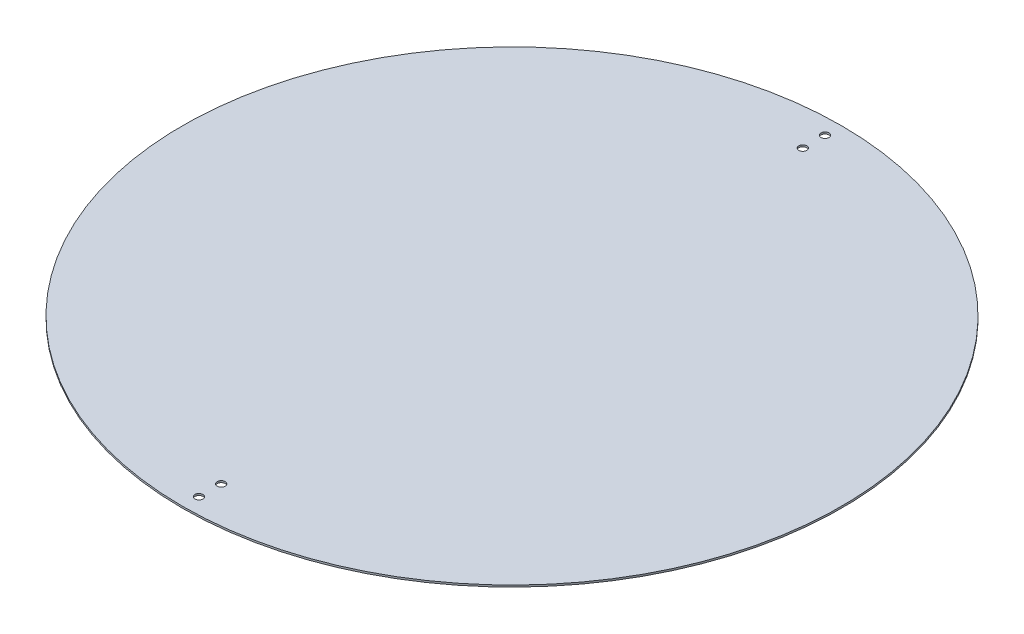
ISO-10303-21;
HEADER;
FILE_DESCRIPTION(('STEP AP214'),'2;1');
FILE_NAME('part.step','',(''),(''),'','','');
FILE_SCHEMA(('AUTOMOTIVE_DESIGN { 1 0 10303 214 1 1 1 1 }'));
ENDSEC;
DATA;
#1=APPLICATION_CONTEXT('core data for automotive mechanical design processes');
#2=APPLICATION_PROTOCOL_DEFINITION('international standard','automotive_design',2000,#1);
#3=PRODUCT_CONTEXT('',#1,'mechanical');
#4=PRODUCT('Part','Part','',(#3));
#5=PRODUCT_RELATED_PRODUCT_CATEGORY('part','',(#4));
#6=PRODUCT_DEFINITION_FORMATION('','',#4);
#7=PRODUCT_DEFINITION_CONTEXT('part definition',#1,'design');
#8=PRODUCT_DEFINITION('design','',#6,#7);
#9=PRODUCT_DEFINITION_SHAPE('','',#8);
#10=(LENGTH_UNIT() NAMED_UNIT(*) SI_UNIT(.MILLI.,.METRE.));
#11=(NAMED_UNIT(*) PLANE_ANGLE_UNIT() SI_UNIT($,.RADIAN.));
#12=(NAMED_UNIT(*) SI_UNIT($,.STERADIAN.) SOLID_ANGLE_UNIT());
#13=UNCERTAINTY_MEASURE_WITH_UNIT(LENGTH_MEASURE(1.E-05),#10,'distance_accuracy_value','');
#14=(GEOMETRIC_REPRESENTATION_CONTEXT(3) GLOBAL_UNCERTAINTY_ASSIGNED_CONTEXT((#13)) GLOBAL_UNIT_ASSIGNED_CONTEXT((#10,
#11,#12)) REPRESENTATION_CONTEXT('',''));
#15=CARTESIAN_POINT('',(0.,0.,0.));
#16=DIRECTION('',(0.,0.,1.));
#17=DIRECTION('',(1.,0.,0.));
#18=AXIS2_PLACEMENT_3D('',#15,#16,#17);
#19=CARTESIAN_POINT('',(0.,1.,0.));
#20=DIRECTION('',(0.,-1.,0.));
#21=DIRECTION('',(0.,0.,-1.));
#22=AXIS2_PLACEMENT_3D('',#19,#20,#21);
#23=CYLINDRICAL_SURFACE('',#22,370.);
#24=CARTESIAN_POINT('',(0.,1.,0.));
#25=DIRECTION('',(0.,1.,0.));
#26=DIRECTION('',(0.,0.,1.));
#27=AXIS2_PLACEMENT_3D('',#24,#25,#26);
#28=CIRCLE('',#27,370.);
#29=CARTESIAN_POINT('',(0.,1.,370.));
#30=VERTEX_POINT('',#29);
#31=EDGE_CURVE('E10',#30,#30,#28,.T.);
#32=ORIENTED_EDGE('',*,*,#31,.F.);
#33=EDGE_LOOP('',(#32));
#34=FACE_BOUND('',#33,.T.);
#35=CARTESIAN_POINT('',(0.,-1.,0.));
#36=DIRECTION('',(0.,1.,0.));
#37=DIRECTION('',(0.,0.,1.));
#38=AXIS2_PLACEMENT_3D('',#35,#36,#37);
#39=CIRCLE('',#38,370.);
#40=CARTESIAN_POINT('',(0.,-1.,370.));
#41=VERTEX_POINT('',#40);
#42=EDGE_CURVE('E37',#41,#41,#39,.T.);
#43=ORIENTED_EDGE('',*,*,#42,.T.);
#44=EDGE_LOOP('',(#43));
#45=FACE_BOUND('',#44,.T.);
#46=ADVANCED_FACE('F34',(#34,#45),#23,.T.);
#47=CARTESIAN_POINT('',(0.,1.,0.));
#48=DIRECTION('',(0.,1.,0.));
#49=DIRECTION('',(0.,0.,1.));
#50=AXIS2_PLACEMENT_3D('',#47,#48,#49);
#51=PLANE('',#50);
#52=CARTESIAN_POINT('',(0.,1.,351.500000000001));
#53=DIRECTION('',(0.,1.,0.));
#54=DIRECTION('',(0.,0.,1.));
#55=AXIS2_PLACEMENT_3D('',#52,#53,#54);
#56=CIRCLE('',#55,4.5);
#57=CARTESIAN_POINT('',(0.,1.,356.000000000001));
#58=VERTEX_POINT('',#57);
#59=EDGE_CURVE('E62',#58,#58,#56,.T.);
#60=ORIENTED_EDGE('',*,*,#59,.F.);
#61=EDGE_LOOP('',(#60));
#62=FACE_BOUND('',#61,.T.);
#63=CARTESIAN_POINT('',(0.,1.,326.500000000001));
#64=DIRECTION('',(0.,1.,0.));
#65=DIRECTION('',(0.,0.,1.));
#66=AXIS2_PLACEMENT_3D('',#63,#64,#65);
#67=CIRCLE('',#66,4.50000000000001);
#68=CARTESIAN_POINT('',(0.,1.,331.000000000001));
#69=VERTEX_POINT('',#68);
#70=EDGE_CURVE('E56',#69,#69,#67,.T.);
#71=ORIENTED_EDGE('',*,*,#70,.F.);
#72=EDGE_LOOP('',(#71));
#73=FACE_BOUND('',#72,.T.);
#74=CARTESIAN_POINT('',(0.,1.,-326.499999999999));
#75=DIRECTION('',(0.,1.,0.));
#76=DIRECTION('',(0.,0.,1.));
#77=AXIS2_PLACEMENT_3D('',#74,#75,#76);
#78=CIRCLE('',#77,4.5);
#79=CARTESIAN_POINT('',(0.,1.,-321.999999999999));
#80=VERTEX_POINT('',#79);
#81=EDGE_CURVE('E49',#80,#80,#78,.T.);
#82=ORIENTED_EDGE('',*,*,#81,.F.);
#83=EDGE_LOOP('',(#82));
#84=FACE_BOUND('',#83,.T.);
#85=CARTESIAN_POINT('',(0.,1.,-351.499999999999));
#86=DIRECTION('',(0.,1.,0.));
#87=DIRECTION('',(0.,0.,1.));
#88=AXIS2_PLACEMENT_3D('',#85,#86,#87);
#89=CIRCLE('',#88,4.5);
#90=CARTESIAN_POINT('',(0.,1.,-346.999999999999));
#91=VERTEX_POINT('',#90);
#92=EDGE_CURVE('E50',#91,#91,#89,.T.);
#93=ORIENTED_EDGE('',*,*,#92,.F.);
#94=EDGE_LOOP('',(#93));
#95=FACE_BOUND('',#94,.T.);
#96=ORIENTED_EDGE('',*,*,#31,.T.);
#97=EDGE_LOOP('',(#96));
#98=FACE_BOUND('',#97,.T.);
#99=ADVANCED_FACE('F73',(#62,#73,#84,#95,#98),#51,.T.);
#100=CARTESIAN_POINT('',(0.,-1.,0.));
#101=DIRECTION('',(0.,1.,0.));
#102=DIRECTION('',(0.,0.,1.));
#103=AXIS2_PLACEMENT_3D('',#100,#101,#102);
#104=PLANE('',#103);
#105=CARTESIAN_POINT('',(0.,-1.,351.500000000001));
#106=DIRECTION('',(0.,1.,0.));
#107=DIRECTION('',(0.,0.,1.));
#108=AXIS2_PLACEMENT_3D('',#105,#106,#107);
#109=CIRCLE('',#108,4.5);
#110=CARTESIAN_POINT('',(0.,-1.,356.000000000001));
#111=VERTEX_POINT('',#110);
#112=EDGE_CURVE('E44',#111,#111,#109,.F.);
#113=ORIENTED_EDGE('',*,*,#112,.F.);
#114=EDGE_LOOP('',(#113));
#115=FACE_BOUND('',#114,.T.);
#116=CARTESIAN_POINT('',(0.,-1.,326.500000000001));
#117=DIRECTION('',(0.,1.,0.));
#118=DIRECTION('',(0.,0.,1.));
#119=AXIS2_PLACEMENT_3D('',#116,#117,#118);
#120=CIRCLE('',#119,4.50000000000001);
#121=CARTESIAN_POINT('',(0.,-1.,331.000000000001));
#122=VERTEX_POINT('',#121);
#123=EDGE_CURVE('E59',#122,#122,#120,.F.);
#124=ORIENTED_EDGE('',*,*,#123,.F.);
#125=EDGE_LOOP('',(#124));
#126=FACE_BOUND('',#125,.T.);
#127=CARTESIAN_POINT('',(0.,-1.,-326.499999999999));
#128=DIRECTION('',(0.,1.,0.));
#129=DIRECTION('',(0.,0.,1.));
#130=AXIS2_PLACEMENT_3D('',#127,#128,#129);
#131=CIRCLE('',#130,4.5);
#132=CARTESIAN_POINT('',(0.,-1.,-321.999999999999));
#133=VERTEX_POINT('',#132);
#134=EDGE_CURVE('E53',#133,#133,#131,.F.);
#135=ORIENTED_EDGE('',*,*,#134,.F.);
#136=EDGE_LOOP('',(#135));
#137=FACE_BOUND('',#136,.T.);
#138=CARTESIAN_POINT('',(0.,-1.,-351.499999999999));
#139=DIRECTION('',(0.,1.,0.));
#140=DIRECTION('',(0.,0.,1.));
#141=AXIS2_PLACEMENT_3D('',#138,#139,#140);
#142=CIRCLE('',#141,4.5);
#143=CARTESIAN_POINT('',(0.,-1.,-346.999999999999));
#144=VERTEX_POINT('',#143);
#145=EDGE_CURVE('E46',#144,#144,#142,.F.);
#146=ORIENTED_EDGE('',*,*,#145,.F.);
#147=EDGE_LOOP('',(#146));
#148=FACE_BOUND('',#147,.T.);
#149=ORIENTED_EDGE('',*,*,#42,.F.);
#150=EDGE_LOOP('',(#149));
#151=FACE_BOUND('',#150,.T.);
#152=ADVANCED_FACE('F76',(#115,#126,#137,#148,#151),#104,.F.);
#153=CARTESIAN_POINT('',(0.,-1.001,-351.499999999999));
#154=DIRECTION('',(0.,1.,0.));
#155=DIRECTION('',(0.,0.,1.));
#156=AXIS2_PLACEMENT_3D('',#153,#154,#155);
#157=CYLINDRICAL_SURFACE('',#156,4.5);
#158=ORIENTED_EDGE('',*,*,#92,.T.);
#159=EDGE_LOOP('',(#158));
#160=FACE_BOUND('',#159,.T.);
#161=ORIENTED_EDGE('',*,*,#145,.T.);
#162=EDGE_LOOP('',(#161));
#163=FACE_BOUND('',#162,.T.);
#164=ADVANCED_FACE('F84',(#160,#163),#157,.F.);
#165=CARTESIAN_POINT('',(0.,-1.001,-326.499999999999));
#166=DIRECTION('',(0.,1.,0.));
#167=DIRECTION('',(0.,0.,1.));
#168=AXIS2_PLACEMENT_3D('',#165,#166,#167);
#169=CYLINDRICAL_SURFACE('',#168,4.5);
#170=ORIENTED_EDGE('',*,*,#81,.T.);
#171=EDGE_LOOP('',(#170));
#172=FACE_BOUND('',#171,.T.);
#173=ORIENTED_EDGE('',*,*,#134,.T.);
#174=EDGE_LOOP('',(#173));
#175=FACE_BOUND('',#174,.T.);
#176=ADVANCED_FACE('F87',(#172,#175),#169,.F.);
#177=CARTESIAN_POINT('',(0.,-1.001,326.500000000001));
#178=DIRECTION('',(0.,1.,0.));
#179=DIRECTION('',(0.,0.,1.));
#180=AXIS2_PLACEMENT_3D('',#177,#178,#179);
#181=CYLINDRICAL_SURFACE('',#180,4.50000000000001);
#182=ORIENTED_EDGE('',*,*,#70,.T.);
#183=EDGE_LOOP('',(#182));
#184=FACE_BOUND('',#183,.T.);
#185=ORIENTED_EDGE('',*,*,#123,.T.);
#186=EDGE_LOOP('',(#185));
#187=FACE_BOUND('',#186,.T.);
#188=ADVANCED_FACE('F124',(#184,#187),#181,.F.);
#189=CARTESIAN_POINT('',(0.,-1.001,351.500000000001));
#190=DIRECTION('',(0.,1.,0.));
#191=DIRECTION('',(0.,0.,1.));
#192=AXIS2_PLACEMENT_3D('',#189,#190,#191);
#193=CYLINDRICAL_SURFACE('',#192,4.5);
#194=ORIENTED_EDGE('',*,*,#59,.T.);
#195=EDGE_LOOP('',(#194));
#196=FACE_BOUND('',#195,.T.);
#197=ORIENTED_EDGE('',*,*,#112,.T.);
#198=EDGE_LOOP('',(#197));
#199=FACE_BOUND('',#198,.T.);
#200=ADVANCED_FACE('F70',(#196,#199),#193,.F.);
#201=CLOSED_SHELL('',(#46,#99,#152,#164,#176,#188,#200));
#202=MANIFOLD_SOLID_BREP('B2',#201);
#203=ADVANCED_BREP_SHAPE_REPRESENTATION('',(#18,#202),#14);
#204=SHAPE_DEFINITION_REPRESENTATION(#9,#203);
ENDSEC;
END-ISO-10303-21;
